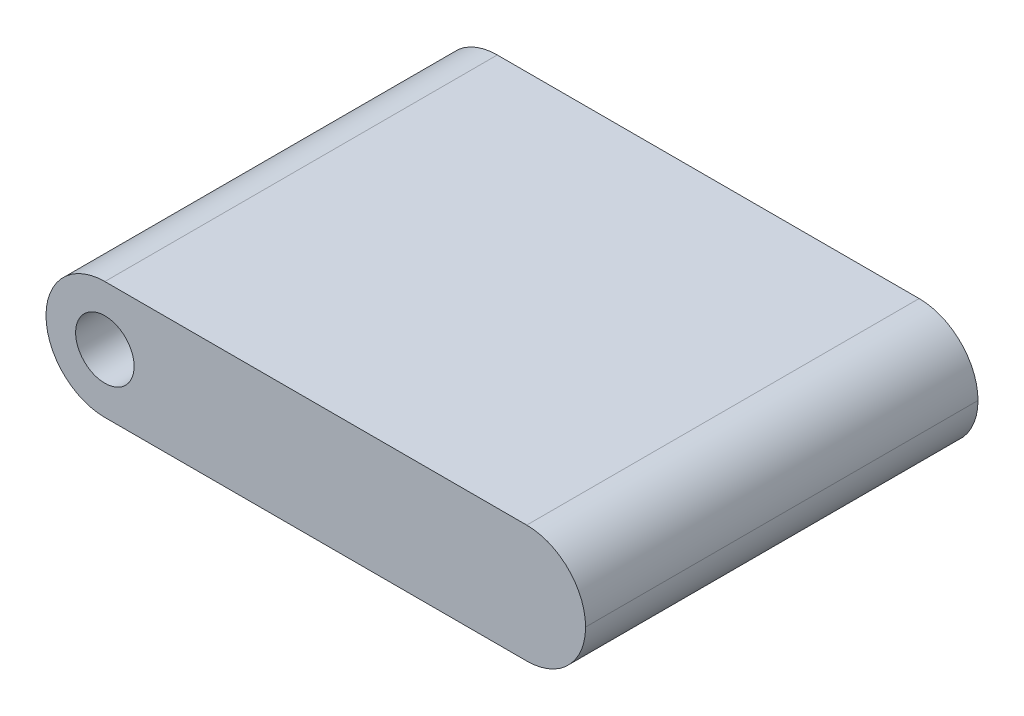
ISO-10303-21;
HEADER;
FILE_DESCRIPTION(('STEP AP214'),'2;1');
FILE_NAME('part.step','',(''),(''),'','','');
FILE_SCHEMA(('AUTOMOTIVE_DESIGN { 1 0 10303 214 1 1 1 1 }'));
ENDSEC;
DATA;
#1=APPLICATION_CONTEXT('core data for automotive mechanical design processes');
#2=APPLICATION_PROTOCOL_DEFINITION('international standard','automotive_design',2000,#1);
#3=PRODUCT_CONTEXT('',#1,'mechanical');
#4=PRODUCT('Part','Part','',(#3));
#5=PRODUCT_RELATED_PRODUCT_CATEGORY('part','',(#4));
#6=PRODUCT_DEFINITION_FORMATION('','',#4);
#7=PRODUCT_DEFINITION_CONTEXT('part definition',#1,'design');
#8=PRODUCT_DEFINITION('design','',#6,#7);
#9=PRODUCT_DEFINITION_SHAPE('','',#8);
#10=(LENGTH_UNIT() NAMED_UNIT(*) SI_UNIT(.MILLI.,.METRE.));
#11=(NAMED_UNIT(*) PLANE_ANGLE_UNIT() SI_UNIT($,.RADIAN.));
#12=(NAMED_UNIT(*) SI_UNIT($,.STERADIAN.) SOLID_ANGLE_UNIT());
#13=UNCERTAINTY_MEASURE_WITH_UNIT(LENGTH_MEASURE(1.E-05),#10,'distance_accuracy_value','');
#14=(GEOMETRIC_REPRESENTATION_CONTEXT(3) GLOBAL_UNCERTAINTY_ASSIGNED_CONTEXT((#13)) GLOBAL_UNIT_ASSIGNED_CONTEXT((#10,
#11,#12)) REPRESENTATION_CONTEXT('',''));
#15=CARTESIAN_POINT('',(0.,0.,0.));
#16=DIRECTION('',(0.,0.,1.));
#17=DIRECTION('',(1.,0.,0.));
#18=AXIS2_PLACEMENT_3D('',#15,#16,#17);
#19=CARTESIAN_POINT('',(0.,0.,20.));
#20=DIRECTION('',(0.,0.,1.));
#21=DIRECTION('',(1.,0.,0.));
#22=AXIS2_PLACEMENT_3D('',#19,#20,#21);
#23=PLANE('',#22);
#24=DIRECTION('',(1.,0.,0.));
#25=VECTOR('',#24,1.);
#26=CARTESIAN_POINT('',(-6.,-6.,20.));
#27=LINE('',#26,#25);
#28=CARTESIAN_POINT('',(0.,-6.,20.));
#29=VERTEX_POINT('',#28);
#30=CARTESIAN_POINT('',(43.,-6.,20.));
#31=VERTEX_POINT('',#30);
#32=EDGE_CURVE('E111',#29,#31,#27,.T.);
#33=ORIENTED_EDGE('',*,*,#32,.T.);
#34=CARTESIAN_POINT('',(43.,0.,20.));
#35=DIRECTION('',(0.,0.,1.));
#36=DIRECTION('',(1.,0.,0.));
#37=AXIS2_PLACEMENT_3D('',#34,#35,#36);
#38=CIRCLE('',#37,6.);
#39=CARTESIAN_POINT('',(49.,0.,20.));
#40=VERTEX_POINT('',#39);
#41=EDGE_CURVE('E138',#31,#40,#38,.T.);
#42=ORIENTED_EDGE('',*,*,#41,.T.);
#43=CARTESIAN_POINT('',(43.,0.,20.));
#44=DIRECTION('',(0.,0.,1.));
#45=DIRECTION('',(1.,0.,0.));
#46=AXIS2_PLACEMENT_3D('',#43,#44,#45);
#47=CIRCLE('',#46,6.);
#48=CARTESIAN_POINT('',(43.,6.00000000000001,20.));
#49=VERTEX_POINT('',#48);
#50=EDGE_CURVE('E136',#40,#49,#47,.T.);
#51=ORIENTED_EDGE('',*,*,#50,.T.);
#52=DIRECTION('',(-1.,0.,0.));
#53=VECTOR('',#52,1.);
#54=CARTESIAN_POINT('',(49.,6.00000000000001,20.));
#55=LINE('',#54,#53);
#56=CARTESIAN_POINT('',(0.,6.,20.));
#57=VERTEX_POINT('',#56);
#58=EDGE_CURVE('E126',#49,#57,#55,.T.);
#59=ORIENTED_EDGE('',*,*,#58,.T.);
#60=CARTESIAN_POINT('',(0.,0.,20.));
#61=DIRECTION('',(0.,0.,1.));
#62=DIRECTION('',(1.,0.,0.));
#63=AXIS2_PLACEMENT_3D('',#60,#61,#62);
#64=CIRCLE('',#63,6.);
#65=CARTESIAN_POINT('',(-6.,0.,20.));
#66=VERTEX_POINT('',#65);
#67=EDGE_CURVE('E54',#57,#66,#64,.T.);
#68=ORIENTED_EDGE('',*,*,#67,.T.);
#69=CARTESIAN_POINT('',(0.,0.,20.));
#70=DIRECTION('',(0.,0.,1.));
#71=DIRECTION('',(1.,0.,0.));
#72=AXIS2_PLACEMENT_3D('',#69,#70,#71);
#73=CIRCLE('',#72,6.);
#74=EDGE_CURVE('E134',#66,#29,#73,.T.);
#75=ORIENTED_EDGE('',*,*,#74,.T.);
#76=EDGE_LOOP('',(#33,#42,#51,#59,#68,#75));
#77=FACE_BOUND('',#76,.T.);
#78=CARTESIAN_POINT('',(0.,0.,20.));
#79=DIRECTION('',(0.,0.,1.));
#80=DIRECTION('',(1.,0.,0.));
#81=AXIS2_PLACEMENT_3D('',#78,#79,#80);
#82=CIRCLE('',#81,2.98);
#83=CARTESIAN_POINT('',(2.98,0.,20.));
#84=VERTEX_POINT('',#83);
#85=EDGE_CURVE('E119',#84,#84,#82,.T.);
#86=ORIENTED_EDGE('',*,*,#85,.F.);
#87=EDGE_LOOP('',(#86));
#88=FACE_BOUND('',#87,.T.);
#89=ADVANCED_FACE('F37',(#77,#88),#23,.T.);
#90=CARTESIAN_POINT('',(0.,0.,-20.));
#91=DIRECTION('',(0.,0.,1.));
#92=DIRECTION('',(1.,0.,0.));
#93=AXIS2_PLACEMENT_3D('',#90,#91,#92);
#94=PLANE('',#93);
#95=CARTESIAN_POINT('',(43.,0.,-20.));
#96=DIRECTION('',(0.,0.,1.));
#97=DIRECTION('',(1.,0.,0.));
#98=AXIS2_PLACEMENT_3D('',#95,#96,#97);
#99=CIRCLE('',#98,6.);
#100=CARTESIAN_POINT('',(43.,6.00000000000001,-20.));
#101=VERTEX_POINT('',#100);
#102=CARTESIAN_POINT('',(49.,0.,-20.));
#103=VERTEX_POINT('',#102);
#104=EDGE_CURVE('E100',#101,#103,#99,.F.);
#105=ORIENTED_EDGE('',*,*,#104,.T.);
#106=CARTESIAN_POINT('',(43.,0.,-20.));
#107=DIRECTION('',(0.,0.,1.));
#108=DIRECTION('',(1.,0.,0.));
#109=AXIS2_PLACEMENT_3D('',#106,#107,#108);
#110=CIRCLE('',#109,6.);
#111=CARTESIAN_POINT('',(43.,-6.,-20.));
#112=VERTEX_POINT('',#111);
#113=EDGE_CURVE('E113',#103,#112,#110,.F.);
#114=ORIENTED_EDGE('',*,*,#113,.T.);
#115=DIRECTION('',(1.,0.,0.));
#116=VECTOR('',#115,1.);
#117=CARTESIAN_POINT('',(-6.,-6.,-20.));
#118=LINE('',#117,#116);
#119=CARTESIAN_POINT('',(0.,-6.,-20.));
#120=VERTEX_POINT('',#119);
#121=EDGE_CURVE('E108',#120,#112,#118,.T.);
#122=ORIENTED_EDGE('',*,*,#121,.F.);
#123=CARTESIAN_POINT('',(0.,0.,-20.));
#124=DIRECTION('',(0.,0.,1.));
#125=DIRECTION('',(1.,0.,0.));
#126=AXIS2_PLACEMENT_3D('',#123,#124,#125);
#127=CIRCLE('',#126,6.);
#128=CARTESIAN_POINT('',(-6.,0.,-20.));
#129=VERTEX_POINT('',#128);
#130=EDGE_CURVE('E92',#120,#129,#127,.F.);
#131=ORIENTED_EDGE('',*,*,#130,.T.);
#132=CARTESIAN_POINT('',(0.,0.,-20.));
#133=DIRECTION('',(0.,0.,1.));
#134=DIRECTION('',(1.,0.,0.));
#135=AXIS2_PLACEMENT_3D('',#132,#133,#134);
#136=CIRCLE('',#135,6.);
#137=CARTESIAN_POINT('',(0.,6.,-20.));
#138=VERTEX_POINT('',#137);
#139=EDGE_CURVE('E101',#129,#138,#136,.F.);
#140=ORIENTED_EDGE('',*,*,#139,.T.);
#141=DIRECTION('',(-1.,0.,0.));
#142=VECTOR('',#141,1.);
#143=CARTESIAN_POINT('',(49.,6.00000000000001,-20.));
#144=LINE('',#143,#142);
#145=EDGE_CURVE('E118',#101,#138,#144,.T.);
#146=ORIENTED_EDGE('',*,*,#145,.F.);
#147=EDGE_LOOP('',(#105,#114,#122,#131,#140,#146));
#148=FACE_BOUND('',#147,.T.);
#149=CARTESIAN_POINT('',(0.,0.,-20.));
#150=DIRECTION('',(0.,0.,1.));
#151=DIRECTION('',(1.,0.,0.));
#152=AXIS2_PLACEMENT_3D('',#149,#150,#151);
#153=CIRCLE('',#152,2.98);
#154=CARTESIAN_POINT('',(2.98,0.,-20.));
#155=VERTEX_POINT('',#154);
#156=EDGE_CURVE('E123',#155,#155,#153,.T.);
#157=ORIENTED_EDGE('',*,*,#156,.T.);
#158=EDGE_LOOP('',(#157));
#159=FACE_BOUND('',#158,.T.);
#160=ADVANCED_FACE('F115',(#148,#159),#94,.F.);
#161=CARTESIAN_POINT('',(-6.,-6.,20.));
#162=DIRECTION('',(0.,1.,0.));
#163=DIRECTION('',(0.,0.,1.));
#164=AXIS2_PLACEMENT_3D('',#161,#162,#163);
#165=PLANE('',#164);
#166=ORIENTED_EDGE('',*,*,#121,.T.);
#167=DIRECTION('',(0.,0.,-1.));
#168=VECTOR('',#167,1.);
#169=CARTESIAN_POINT('',(43.,-6.,20.));
#170=LINE('',#169,#168);
#171=EDGE_CURVE('E112',#112,#31,#170,.F.);
#172=ORIENTED_EDGE('',*,*,#171,.T.);
#173=ORIENTED_EDGE('',*,*,#32,.F.);
#174=DIRECTION('',(0.,0.,-1.));
#175=VECTOR('',#174,1.);
#176=CARTESIAN_POINT('',(0.,-6.,20.));
#177=LINE('',#176,#175);
#178=EDGE_CURVE('E96',#29,#120,#177,.T.);
#179=ORIENTED_EDGE('',*,*,#178,.T.);
#180=EDGE_LOOP('',(#166,#172,#173,#179));
#181=FACE_BOUND('',#180,.T.);
#182=ADVANCED_FACE('F106',(#181),#165,.F.);
#183=CARTESIAN_POINT('',(49.,6.00000000000001,20.));
#184=DIRECTION('',(0.,-1.,0.));
#185=DIRECTION('',(1.,0.,0.));
#186=AXIS2_PLACEMENT_3D('',#183,#184,#185);
#187=PLANE('',#186);
#188=ORIENTED_EDGE('',*,*,#58,.F.);
#189=DIRECTION('',(0.,0.,-1.));
#190=VECTOR('',#189,1.);
#191=CARTESIAN_POINT('',(43.,6.00000000000001,20.));
#192=LINE('',#191,#190);
#193=EDGE_CURVE('E11',#49,#101,#192,.T.);
#194=ORIENTED_EDGE('',*,*,#193,.T.);
#195=ORIENTED_EDGE('',*,*,#145,.T.);
#196=DIRECTION('',(0.,0.,-1.));
#197=VECTOR('',#196,1.);
#198=CARTESIAN_POINT('',(0.,6.,20.));
#199=LINE('',#198,#197);
#200=EDGE_CURVE('E46',#138,#57,#199,.F.);
#201=ORIENTED_EDGE('',*,*,#200,.T.);
#202=EDGE_LOOP('',(#188,#194,#195,#201));
#203=FACE_BOUND('',#202,.T.);
#204=ADVANCED_FACE('F153',(#203),#187,.F.);
#205=CARTESIAN_POINT('',(0.,0.,20.));
#206=DIRECTION('',(0.,0.,-1.));
#207=DIRECTION('',(-1.,0.,0.));
#208=AXIS2_PLACEMENT_3D('',#205,#206,#207);
#209=CYLINDRICAL_SURFACE('',#208,2.98);
#210=ORIENTED_EDGE('',*,*,#85,.T.);
#211=EDGE_LOOP('',(#210));
#212=FACE_BOUND('',#211,.T.);
#213=ORIENTED_EDGE('',*,*,#156,.F.);
#214=EDGE_LOOP('',(#213));
#215=FACE_BOUND('',#214,.T.);
#216=ADVANCED_FACE('F163',(#212,#215),#209,.F.);
#217=CARTESIAN_POINT('',(43.,0.,20.));
#218=DIRECTION('',(0.,0.,-1.));
#219=DIRECTION('',(-1.,0.,0.));
#220=AXIS2_PLACEMENT_3D('',#217,#218,#219);
#221=CYLINDRICAL_SURFACE('',#220,6.);
#222=ORIENTED_EDGE('',*,*,#193,.F.);
#223=ORIENTED_EDGE('',*,*,#50,.F.);
#224=DIRECTION('',(0.,0.,-1.));
#225=VECTOR('',#224,1.);
#226=CARTESIAN_POINT('',(49.,0.,20.));
#227=LINE('',#226,#225);
#228=EDGE_CURVE('E140',#103,#40,#227,.F.);
#229=ORIENTED_EDGE('',*,*,#228,.F.);
#230=ORIENTED_EDGE('',*,*,#104,.F.);
#231=EDGE_LOOP('',(#222,#223,#229,#230));
#232=FACE_BOUND('',#231,.T.);
#233=ADVANCED_FACE('F155',(#232),#221,.T.);
#234=CARTESIAN_POINT('',(43.,0.,20.));
#235=DIRECTION('',(0.,0.,-1.));
#236=DIRECTION('',(-1.,0.,0.));
#237=AXIS2_PLACEMENT_3D('',#234,#235,#236);
#238=CYLINDRICAL_SURFACE('',#237,6.);
#239=ORIENTED_EDGE('',*,*,#41,.F.);
#240=ORIENTED_EDGE('',*,*,#171,.F.);
#241=ORIENTED_EDGE('',*,*,#113,.F.);
#242=ORIENTED_EDGE('',*,*,#228,.T.);
#243=EDGE_LOOP('',(#239,#240,#241,#242));
#244=FACE_BOUND('',#243,.T.);
#245=ADVANCED_FACE('F156',(#244),#238,.T.);
#246=CARTESIAN_POINT('',(0.,0.,20.));
#247=DIRECTION('',(0.,0.,-1.));
#248=DIRECTION('',(-1.,0.,0.));
#249=AXIS2_PLACEMENT_3D('',#246,#247,#248);
#250=CYLINDRICAL_SURFACE('',#249,6.);
#251=DIRECTION('',(0.,0.,-1.));
#252=VECTOR('',#251,1.);
#253=CARTESIAN_POINT('',(-6.,0.,20.));
#254=LINE('',#253,#252);
#255=EDGE_CURVE('E41',#66,#129,#254,.T.);
#256=ORIENTED_EDGE('',*,*,#255,.F.);
#257=ORIENTED_EDGE('',*,*,#67,.F.);
#258=ORIENTED_EDGE('',*,*,#200,.F.);
#259=ORIENTED_EDGE('',*,*,#139,.F.);
#260=EDGE_LOOP('',(#256,#257,#258,#259));
#261=FACE_BOUND('',#260,.T.);
#262=ADVANCED_FACE('F39',(#261),#250,.T.);
#263=CARTESIAN_POINT('',(0.,0.,20.));
#264=DIRECTION('',(0.,0.,-1.));
#265=DIRECTION('',(-1.,0.,0.));
#266=AXIS2_PLACEMENT_3D('',#263,#264,#265);
#267=CYLINDRICAL_SURFACE('',#266,6.);
#268=ORIENTED_EDGE('',*,*,#74,.F.);
#269=ORIENTED_EDGE('',*,*,#255,.T.);
#270=ORIENTED_EDGE('',*,*,#130,.F.);
#271=ORIENTED_EDGE('',*,*,#178,.F.);
#272=EDGE_LOOP('',(#268,#269,#270,#271));
#273=FACE_BOUND('',#272,.T.);
#274=ADVANCED_FACE('F95',(#273),#267,.T.);
#275=CLOSED_SHELL('',(#89,#160,#182,#204,#216,#233,#245,#262,#274));
#276=MANIFOLD_SOLID_BREP('B2',#275);
#277=ADVANCED_BREP_SHAPE_REPRESENTATION('',(#18,#276),#14);
#278=SHAPE_DEFINITION_REPRESENTATION(#9,#277);
ENDSEC;
END-ISO-10303-21;
